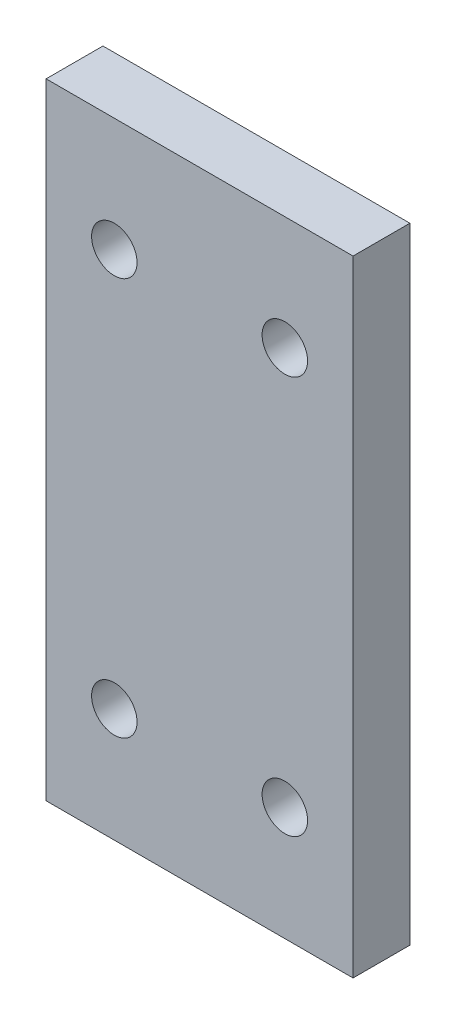
ISO-10303-21;
HEADER;
FILE_DESCRIPTION(('STEP AP214'),'2;1');
FILE_NAME('part.step','',(''),(''),'','','');
FILE_SCHEMA(('AUTOMOTIVE_DESIGN { 1 0 10303 214 1 1 1 1 }'));
ENDSEC;
DATA;
#1=APPLICATION_CONTEXT('core data for automotive mechanical design processes');
#2=APPLICATION_PROTOCOL_DEFINITION('international standard','automotive_design',2000,#1);
#3=PRODUCT_CONTEXT('',#1,'mechanical');
#4=PRODUCT('Part','Part','',(#3));
#5=PRODUCT_RELATED_PRODUCT_CATEGORY('part','',(#4));
#6=PRODUCT_DEFINITION_FORMATION('','',#4);
#7=PRODUCT_DEFINITION_CONTEXT('part definition',#1,'design');
#8=PRODUCT_DEFINITION('design','',#6,#7);
#9=PRODUCT_DEFINITION_SHAPE('','',#8);
#10=(LENGTH_UNIT() NAMED_UNIT(*) SI_UNIT(.MILLI.,.METRE.));
#11=(NAMED_UNIT(*) PLANE_ANGLE_UNIT() SI_UNIT($,.RADIAN.));
#12=(NAMED_UNIT(*) SI_UNIT($,.STERADIAN.) SOLID_ANGLE_UNIT());
#13=UNCERTAINTY_MEASURE_WITH_UNIT(LENGTH_MEASURE(1.E-05),#10,'distance_accuracy_value','');
#14=(GEOMETRIC_REPRESENTATION_CONTEXT(3) GLOBAL_UNCERTAINTY_ASSIGNED_CONTEXT((#13)) GLOBAL_UNIT_ASSIGNED_CONTEXT((#10,
#11,#12)) REPRESENTATION_CONTEXT('',''));
#15=CARTESIAN_POINT('',(0.,0.,0.));
#16=DIRECTION('',(0.,0.,1.));
#17=DIRECTION('',(1.,0.,0.));
#18=AXIS2_PLACEMENT_3D('',#15,#16,#17);
#19=CARTESIAN_POINT('',(0.,0.,5.));
#20=DIRECTION('',(0.,0.,1.));
#21=DIRECTION('',(1.,0.,0.));
#22=AXIS2_PLACEMENT_3D('',#19,#20,#21);
#23=PLANE('',#22);
#24=CARTESIAN_POINT('',(-5.99999999999999,10.,5.));
#25=DIRECTION('',(0.,0.,1.));
#26=DIRECTION('',(-1.,0.,0.));
#27=AXIS2_PLACEMENT_3D('',#24,#25,#26);
#28=CIRCLE('',#27,2.);
#29=CARTESIAN_POINT('',(-7.99999999999999,10.,5.));
#30=VERTEX_POINT('',#29);
#31=EDGE_CURVE('E123',#30,#30,#28,.T.);
#32=ORIENTED_EDGE('',*,*,#31,.F.);
#33=EDGE_LOOP('',(#32));
#34=FACE_BOUND('',#33,.T.);
#35=CARTESIAN_POINT('',(-21.,45.,5.));
#36=DIRECTION('',(0.,0.,1.));
#37=DIRECTION('',(1.,0.,0.));
#38=AXIS2_PLACEMENT_3D('',#35,#36,#37);
#39=CIRCLE('',#38,2.00000000000001);
#40=CARTESIAN_POINT('',(-19.,45.,5.));
#41=VERTEX_POINT('',#40);
#42=EDGE_CURVE('E102',#41,#41,#39,.T.);
#43=ORIENTED_EDGE('',*,*,#42,.F.);
#44=EDGE_LOOP('',(#43));
#45=FACE_BOUND('',#44,.T.);
#46=DIRECTION('',(0.,1.,0.));
#47=VECTOR('',#46,1.);
#48=CARTESIAN_POINT('',(0.,0.,5.));
#49=LINE('',#48,#47);
#50=CARTESIAN_POINT('',(0.,0.,5.));
#51=VERTEX_POINT('',#50);
#52=CARTESIAN_POINT('',(0.,55.,5.));
#53=VERTEX_POINT('',#52);
#54=EDGE_CURVE('E87',#51,#53,#49,.T.);
#55=ORIENTED_EDGE('',*,*,#54,.T.);
#56=DIRECTION('',(-1.,0.,0.));
#57=VECTOR('',#56,1.);
#58=CARTESIAN_POINT('',(0.,55.,5.));
#59=LINE('',#58,#57);
#60=CARTESIAN_POINT('',(-27.,55.,5.));
#61=VERTEX_POINT('',#60);
#62=EDGE_CURVE('E82',#53,#61,#59,.T.);
#63=ORIENTED_EDGE('',*,*,#62,.T.);
#64=DIRECTION('',(0.,-1.,0.));
#65=VECTOR('',#64,1.);
#66=CARTESIAN_POINT('',(-27.,0.,5.));
#67=LINE('',#66,#65);
#68=CARTESIAN_POINT('',(-27.,0.,5.));
#69=VERTEX_POINT('',#68);
#70=EDGE_CURVE('E85',#61,#69,#67,.T.);
#71=ORIENTED_EDGE('',*,*,#70,.T.);
#72=DIRECTION('',(1.,0.,0.));
#73=VECTOR('',#72,1.);
#74=CARTESIAN_POINT('',(0.,0.,5.));
#75=LINE('',#74,#73);
#76=EDGE_CURVE('E52',#69,#51,#75,.T.);
#77=ORIENTED_EDGE('',*,*,#76,.T.);
#78=EDGE_LOOP('',(#55,#63,#71,#77));
#79=FACE_BOUND('',#78,.T.);
#80=CARTESIAN_POINT('',(-21.,10.,5.));
#81=DIRECTION('',(0.,0.,1.));
#82=DIRECTION('',(1.,0.,0.));
#83=AXIS2_PLACEMENT_3D('',#80,#81,#82);
#84=CIRCLE('',#83,2.);
#85=CARTESIAN_POINT('',(-19.,10.,5.));
#86=VERTEX_POINT('',#85);
#87=EDGE_CURVE('E117',#86,#86,#84,.T.);
#88=ORIENTED_EDGE('',*,*,#87,.F.);
#89=EDGE_LOOP('',(#88));
#90=FACE_BOUND('',#89,.T.);
#91=CARTESIAN_POINT('',(-6.,45.,5.));
#92=DIRECTION('',(0.,0.,1.));
#93=DIRECTION('',(-1.,0.,0.));
#94=AXIS2_PLACEMENT_3D('',#91,#92,#93);
#95=CIRCLE('',#94,2.00000000000001);
#96=CARTESIAN_POINT('',(-8.00000000000001,45.,5.));
#97=VERTEX_POINT('',#96);
#98=EDGE_CURVE('E129',#97,#97,#95,.T.);
#99=ORIENTED_EDGE('',*,*,#98,.F.);
#100=EDGE_LOOP('',(#99));
#101=FACE_BOUND('',#100,.T.);
#102=ADVANCED_FACE('F35',(#34,#45,#79,#90,#101),#23,.T.);
#103=CARTESIAN_POINT('',(0.,0.,0.));
#104=DIRECTION('',(0.,0.,1.));
#105=DIRECTION('',(1.,0.,0.));
#106=AXIS2_PLACEMENT_3D('',#103,#104,#105);
#107=PLANE('',#106);
#108=DIRECTION('',(0.,1.,0.));
#109=VECTOR('',#108,1.);
#110=CARTESIAN_POINT('',(0.,0.,0.));
#111=LINE('',#110,#109);
#112=CARTESIAN_POINT('',(0.,0.,0.));
#113=VERTEX_POINT('',#112);
#114=CARTESIAN_POINT('',(0.,55.,0.));
#115=VERTEX_POINT('',#114);
#116=EDGE_CURVE('E99',#113,#115,#111,.T.);
#117=ORIENTED_EDGE('',*,*,#116,.F.);
#118=DIRECTION('',(1.,0.,0.));
#119=VECTOR('',#118,1.);
#120=CARTESIAN_POINT('',(0.,0.,0.));
#121=LINE('',#120,#119);
#122=CARTESIAN_POINT('',(-27.,0.,0.));
#123=VERTEX_POINT('',#122);
#124=EDGE_CURVE('E75',#123,#113,#121,.T.);
#125=ORIENTED_EDGE('',*,*,#124,.F.);
#126=DIRECTION('',(0.,-1.,0.));
#127=VECTOR('',#126,1.);
#128=CARTESIAN_POINT('',(-27.,0.,0.));
#129=LINE('',#128,#127);
#130=CARTESIAN_POINT('',(-27.,55.,0.));
#131=VERTEX_POINT('',#130);
#132=EDGE_CURVE('E69',#131,#123,#129,.T.);
#133=ORIENTED_EDGE('',*,*,#132,.F.);
#134=DIRECTION('',(-1.,0.,0.));
#135=VECTOR('',#134,1.);
#136=CARTESIAN_POINT('',(0.,55.,0.));
#137=LINE('',#136,#135);
#138=EDGE_CURVE('E91',#115,#131,#137,.T.);
#139=ORIENTED_EDGE('',*,*,#138,.F.);
#140=EDGE_LOOP('',(#117,#125,#133,#139));
#141=FACE_BOUND('',#140,.T.);
#142=CARTESIAN_POINT('',(-21.,45.,0.));
#143=DIRECTION('',(0.,0.,1.));
#144=DIRECTION('',(1.,0.,0.));
#145=AXIS2_PLACEMENT_3D('',#142,#143,#144);
#146=CIRCLE('',#145,2.00000000000001);
#147=CARTESIAN_POINT('',(-19.,45.,0.));
#148=VERTEX_POINT('',#147);
#149=EDGE_CURVE('E114',#148,#148,#146,.T.);
#150=ORIENTED_EDGE('',*,*,#149,.T.);
#151=EDGE_LOOP('',(#150));
#152=FACE_BOUND('',#151,.T.);
#153=CARTESIAN_POINT('',(-21.,10.,0.));
#154=DIRECTION('',(0.,0.,1.));
#155=DIRECTION('',(1.,0.,0.));
#156=AXIS2_PLACEMENT_3D('',#153,#154,#155);
#157=CIRCLE('',#156,2.);
#158=CARTESIAN_POINT('',(-19.,10.,0.));
#159=VERTEX_POINT('',#158);
#160=EDGE_CURVE('E120',#159,#159,#157,.T.);
#161=ORIENTED_EDGE('',*,*,#160,.T.);
#162=EDGE_LOOP('',(#161));
#163=FACE_BOUND('',#162,.T.);
#164=CARTESIAN_POINT('',(-5.99999999999999,10.,0.));
#165=DIRECTION('',(0.,0.,1.));
#166=DIRECTION('',(-1.,0.,0.));
#167=AXIS2_PLACEMENT_3D('',#164,#165,#166);
#168=CIRCLE('',#167,2.);
#169=CARTESIAN_POINT('',(-7.99999999999999,10.,0.));
#170=VERTEX_POINT('',#169);
#171=EDGE_CURVE('E126',#170,#170,#168,.T.);
#172=ORIENTED_EDGE('',*,*,#171,.T.);
#173=EDGE_LOOP('',(#172));
#174=FACE_BOUND('',#173,.T.);
#175=CARTESIAN_POINT('',(-6.,45.,0.));
#176=DIRECTION('',(0.,0.,1.));
#177=DIRECTION('',(-1.,0.,0.));
#178=AXIS2_PLACEMENT_3D('',#175,#176,#177);
#179=CIRCLE('',#178,2.00000000000001);
#180=CARTESIAN_POINT('',(-8.00000000000001,45.,0.));
#181=VERTEX_POINT('',#180);
#182=EDGE_CURVE('E132',#181,#181,#179,.T.);
#183=ORIENTED_EDGE('',*,*,#182,.T.);
#184=EDGE_LOOP('',(#183));
#185=FACE_BOUND('',#184,.T.);
#186=ADVANCED_FACE('F110',(#141,#152,#163,#174,#185),#107,.F.);
#187=CARTESIAN_POINT('',(0.,0.,5.));
#188=DIRECTION('',(-1.,0.,0.));
#189=DIRECTION('',(0.,0.,1.));
#190=AXIS2_PLACEMENT_3D('',#187,#188,#189);
#191=PLANE('',#190);
#192=ORIENTED_EDGE('',*,*,#116,.T.);
#193=DIRECTION('',(0.,0.,-1.));
#194=VECTOR('',#193,1.);
#195=CARTESIAN_POINT('',(0.,55.,5.));
#196=LINE('',#195,#194);
#197=EDGE_CURVE('E11',#53,#115,#196,.T.);
#198=ORIENTED_EDGE('',*,*,#197,.F.);
#199=ORIENTED_EDGE('',*,*,#54,.F.);
#200=DIRECTION('',(0.,0.,-1.));
#201=VECTOR('',#200,1.);
#202=CARTESIAN_POINT('',(0.,0.,5.));
#203=LINE('',#202,#201);
#204=EDGE_CURVE('E95',#51,#113,#203,.T.);
#205=ORIENTED_EDGE('',*,*,#204,.T.);
#206=EDGE_LOOP('',(#192,#198,#199,#205));
#207=FACE_BOUND('',#206,.T.);
#208=ADVANCED_FACE('F37',(#207),#191,.F.);
#209=CARTESIAN_POINT('',(0.,55.,5.));
#210=DIRECTION('',(0.,-1.,0.));
#211=DIRECTION('',(1.,0.,0.));
#212=AXIS2_PLACEMENT_3D('',#209,#210,#211);
#213=PLANE('',#212);
#214=ORIENTED_EDGE('',*,*,#138,.T.);
#215=DIRECTION('',(0.,0.,-1.));
#216=VECTOR('',#215,1.);
#217=CARTESIAN_POINT('',(-27.,55.,5.));
#218=LINE('',#217,#216);
#219=EDGE_CURVE('E44',#61,#131,#218,.T.);
#220=ORIENTED_EDGE('',*,*,#219,.F.);
#221=ORIENTED_EDGE('',*,*,#62,.F.);
#222=ORIENTED_EDGE('',*,*,#197,.T.);
#223=EDGE_LOOP('',(#214,#220,#221,#222));
#224=FACE_BOUND('',#223,.T.);
#225=ADVANCED_FACE('F90',(#224),#213,.F.);
#226=CARTESIAN_POINT('',(-27.,0.,5.));
#227=DIRECTION('',(1.,0.,0.));
#228=DIRECTION('',(0.,0.,-1.));
#229=AXIS2_PLACEMENT_3D('',#226,#227,#228);
#230=PLANE('',#229);
#231=ORIENTED_EDGE('',*,*,#132,.T.);
#232=DIRECTION('',(0.,0.,-1.));
#233=VECTOR('',#232,1.);
#234=CARTESIAN_POINT('',(-27.,0.,5.));
#235=LINE('',#234,#233);
#236=EDGE_CURVE('E92',#69,#123,#235,.T.);
#237=ORIENTED_EDGE('',*,*,#236,.F.);
#238=ORIENTED_EDGE('',*,*,#70,.F.);
#239=ORIENTED_EDGE('',*,*,#219,.T.);
#240=EDGE_LOOP('',(#231,#237,#238,#239));
#241=FACE_BOUND('',#240,.T.);
#242=ADVANCED_FACE('F93',(#241),#230,.F.);
#243=CARTESIAN_POINT('',(0.,0.,5.));
#244=DIRECTION('',(0.,1.,0.));
#245=DIRECTION('',(-1.,0.,0.));
#246=AXIS2_PLACEMENT_3D('',#243,#244,#245);
#247=PLANE('',#246);
#248=ORIENTED_EDGE('',*,*,#124,.T.);
#249=ORIENTED_EDGE('',*,*,#204,.F.);
#250=ORIENTED_EDGE('',*,*,#76,.F.);
#251=ORIENTED_EDGE('',*,*,#236,.T.);
#252=EDGE_LOOP('',(#248,#249,#250,#251));
#253=FACE_BOUND('',#252,.T.);
#254=ADVANCED_FACE('F107',(#253),#247,.F.);
#255=CARTESIAN_POINT('',(-21.,45.,5.));
#256=DIRECTION('',(0.,0.,-1.));
#257=DIRECTION('',(-1.,0.,0.));
#258=AXIS2_PLACEMENT_3D('',#255,#256,#257);
#259=CYLINDRICAL_SURFACE('',#258,2.00000000000001);
#260=ORIENTED_EDGE('',*,*,#42,.T.);
#261=EDGE_LOOP('',(#260));
#262=FACE_BOUND('',#261,.T.);
#263=ORIENTED_EDGE('',*,*,#149,.F.);
#264=EDGE_LOOP('',(#263));
#265=FACE_BOUND('',#264,.T.);
#266=ADVANCED_FACE('F151',(#262,#265),#259,.F.);
#267=CARTESIAN_POINT('',(-21.,10.,5.));
#268=DIRECTION('',(0.,0.,-1.));
#269=DIRECTION('',(-1.,0.,0.));
#270=AXIS2_PLACEMENT_3D('',#267,#268,#269);
#271=CYLINDRICAL_SURFACE('',#270,2.);
#272=ORIENTED_EDGE('',*,*,#87,.T.);
#273=EDGE_LOOP('',(#272));
#274=FACE_BOUND('',#273,.T.);
#275=ORIENTED_EDGE('',*,*,#160,.F.);
#276=EDGE_LOOP('',(#275));
#277=FACE_BOUND('',#276,.T.);
#278=ADVANCED_FACE('F197',(#274,#277),#271,.F.);
#279=CARTESIAN_POINT('',(-5.99999999999999,10.,5.));
#280=DIRECTION('',(0.,0.,-1.));
#281=DIRECTION('',(-1.,0.,0.));
#282=AXIS2_PLACEMENT_3D('',#279,#280,#281);
#283=CYLINDRICAL_SURFACE('',#282,2.);
#284=ORIENTED_EDGE('',*,*,#31,.T.);
#285=EDGE_LOOP('',(#284));
#286=FACE_BOUND('',#285,.T.);
#287=ORIENTED_EDGE('',*,*,#171,.F.);
#288=EDGE_LOOP('',(#287));
#289=FACE_BOUND('',#288,.T.);
#290=ADVANCED_FACE('F205',(#286,#289),#283,.F.);
#291=CARTESIAN_POINT('',(-6.,45.,5.));
#292=DIRECTION('',(0.,0.,-1.));
#293=DIRECTION('',(-1.,0.,0.));
#294=AXIS2_PLACEMENT_3D('',#291,#292,#293);
#295=CYLINDRICAL_SURFACE('',#294,2.00000000000001);
#296=ORIENTED_EDGE('',*,*,#98,.T.);
#297=EDGE_LOOP('',(#296));
#298=FACE_BOUND('',#297,.T.);
#299=ORIENTED_EDGE('',*,*,#182,.F.);
#300=EDGE_LOOP('',(#299));
#301=FACE_BOUND('',#300,.T.);
#302=ADVANCED_FACE('F138',(#298,#301),#295,.F.);
#303=CLOSED_SHELL('',(#102,#186,#208,#225,#242,#254,#266,#278,#290,#302));
#304=MANIFOLD_SOLID_BREP('B2',#303);
#305=ADVANCED_BREP_SHAPE_REPRESENTATION('',(#18,#304),#14);
#306=SHAPE_DEFINITION_REPRESENTATION(#9,#305);
ENDSEC;
END-ISO-10303-21;
